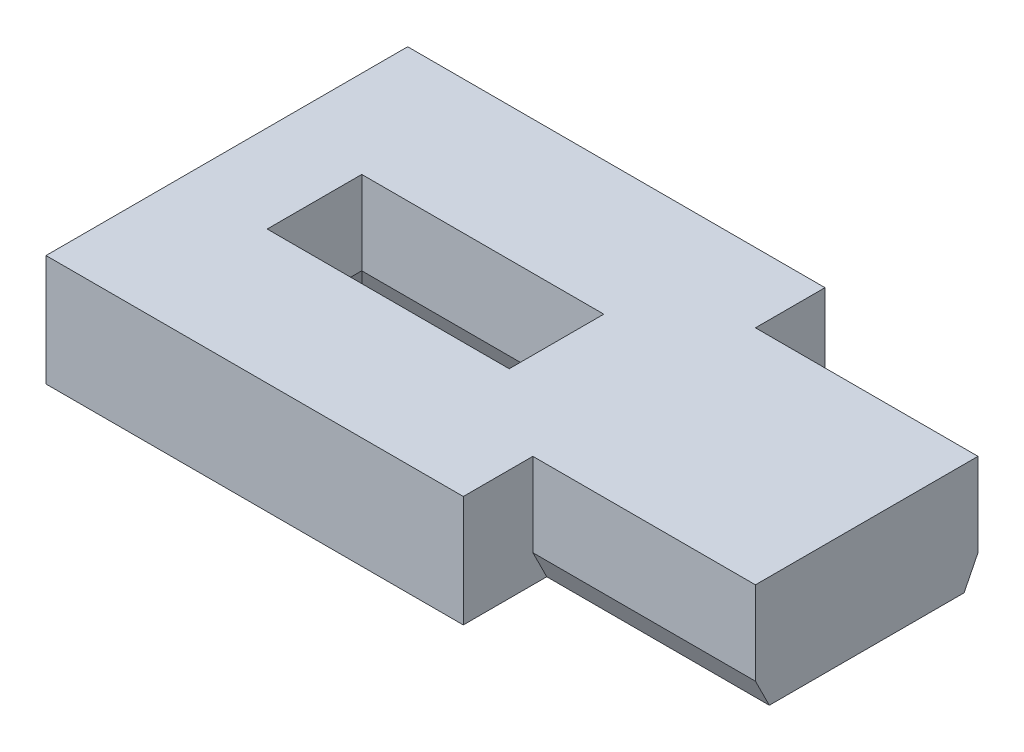
ISO-10303-21;
HEADER;
FILE_DESCRIPTION(('STEP AP214'),'2;1');
FILE_NAME('part.step','',(''),(''),'','','');
FILE_SCHEMA(('AUTOMOTIVE_DESIGN { 1 0 10303 214 1 1 1 1 }'));
ENDSEC;
DATA;
#1=APPLICATION_CONTEXT('core data for automotive mechanical design processes');
#2=APPLICATION_PROTOCOL_DEFINITION('international standard','automotive_design',2000,#1);
#3=PRODUCT_CONTEXT('',#1,'mechanical');
#4=PRODUCT('Part','Part','',(#3));
#5=PRODUCT_RELATED_PRODUCT_CATEGORY('part','',(#4));
#6=PRODUCT_DEFINITION_FORMATION('','',#4);
#7=PRODUCT_DEFINITION_CONTEXT('part definition',#1,'design');
#8=PRODUCT_DEFINITION('design','',#6,#7);
#9=PRODUCT_DEFINITION_SHAPE('','',#8);
#10=(LENGTH_UNIT() NAMED_UNIT(*) SI_UNIT(.MILLI.,.METRE.));
#11=(NAMED_UNIT(*) PLANE_ANGLE_UNIT() SI_UNIT($,.RADIAN.));
#12=(NAMED_UNIT(*) SI_UNIT($,.STERADIAN.) SOLID_ANGLE_UNIT());
#13=UNCERTAINTY_MEASURE_WITH_UNIT(LENGTH_MEASURE(1.E-05),#10,'distance_accuracy_value','');
#14=(GEOMETRIC_REPRESENTATION_CONTEXT(3) GLOBAL_UNCERTAINTY_ASSIGNED_CONTEXT((#13)) GLOBAL_UNIT_ASSIGNED_CONTEXT((#10,
#11,#12)) REPRESENTATION_CONTEXT('',''));
#15=CARTESIAN_POINT('',(0.,0.,0.));
#16=DIRECTION('',(0.,0.,1.));
#17=DIRECTION('',(1.,0.,0.));
#18=AXIS2_PLACEMENT_3D('',#15,#16,#17);
#19=CARTESIAN_POINT('',(7.5,4.,-6.5));
#20=DIRECTION('',(-1.,0.,0.));
#21=DIRECTION('',(0.,0.,1.));
#22=AXIS2_PLACEMENT_3D('',#19,#20,#21);
#23=PLANE('',#22);
#24=DIRECTION('',(0.,-1.,0.));
#25=VECTOR('',#24,1.);
#26=CARTESIAN_POINT('',(7.5,4.,4.));
#27=LINE('',#26,#25);
#28=CARTESIAN_POINT('',(7.5,4.,4.));
#29=VERTEX_POINT('',#28);
#30=CARTESIAN_POINT('',(7.5,1.00000000000001,4.));
#31=VERTEX_POINT('',#30);
#32=EDGE_CURVE('E153',#29,#31,#27,.T.);
#33=ORIENTED_EDGE('',*,*,#32,.F.);
#34=DIRECTION('',(0.,0.,-1.));
#35=VECTOR('',#34,1.);
#36=CARTESIAN_POINT('',(7.5,4.,-6.5));
#37=LINE('',#36,#35);
#38=CARTESIAN_POINT('',(7.5,4.,6.5));
#39=VERTEX_POINT('',#38);
#40=EDGE_CURVE('E164',#39,#29,#37,.T.);
#41=ORIENTED_EDGE('',*,*,#40,.F.);
#42=DIRECTION('',(0.,-1.,0.));
#43=VECTOR('',#42,1.);
#44=CARTESIAN_POINT('',(7.5,4.,6.5));
#45=LINE('',#44,#43);
#46=CARTESIAN_POINT('',(7.5,0.,6.5));
#47=VERTEX_POINT('',#46);
#48=EDGE_CURVE('E197',#39,#47,#45,.T.);
#49=ORIENTED_EDGE('',*,*,#48,.T.);
#50=DIRECTION('',(0.,0.,-1.));
#51=VECTOR('',#50,1.);
#52=CARTESIAN_POINT('',(7.5,0.,-6.5));
#53=LINE('',#52,#51);
#54=CARTESIAN_POINT('',(7.5,0.,3.49999999999999));
#55=VERTEX_POINT('',#54);
#56=EDGE_CURVE('E56',#47,#55,#53,.T.);
#57=ORIENTED_EDGE('',*,*,#56,.T.);
#58=DIRECTION('',(0.,-0.894427190999917,-0.447213595499957));
#59=VECTOR('',#58,1.);
#60=CARTESIAN_POINT('',(7.5,-0.799999999999986,3.10000000000001));
#61=LINE('',#60,#59);
#62=EDGE_CURVE('E43',#55,#31,#61,.F.);
#63=ORIENTED_EDGE('',*,*,#62,.T.);
#64=EDGE_LOOP('',(#33,#41,#49,#57,#63));
#65=FACE_BOUND('',#64,.T.);
#66=ADVANCED_FACE('F34',(#65),#23,.F.);
#67=CARTESIAN_POINT('',(0.,4.,0.));
#68=DIRECTION('',(0.,1.,0.));
#69=DIRECTION('',(0.,0.,1.));
#70=AXIS2_PLACEMENT_3D('',#67,#68,#69);
#71=PLANE('',#70);
#72=DIRECTION('',(0.,0.,1.));
#73=VECTOR('',#72,1.);
#74=CARTESIAN_POINT('',(-7.5,4.,-6.5));
#75=LINE('',#74,#73);
#76=CARTESIAN_POINT('',(-7.5,4.,-6.5));
#77=VERTEX_POINT('',#76);
#78=CARTESIAN_POINT('',(-7.5,4.,6.5));
#79=VERTEX_POINT('',#78);
#80=EDGE_CURVE('E191',#77,#79,#75,.T.);
#81=ORIENTED_EDGE('',*,*,#80,.T.);
#82=DIRECTION('',(1.,0.,0.));
#83=VECTOR('',#82,1.);
#84=CARTESIAN_POINT('',(-7.5,4.,6.5));
#85=LINE('',#84,#83);
#86=EDGE_CURVE('E171',#79,#39,#85,.T.);
#87=ORIENTED_EDGE('',*,*,#86,.T.);
#88=ORIENTED_EDGE('',*,*,#40,.T.);
#89=DIRECTION('',(1.,0.,0.));
#90=VECTOR('',#89,1.);
#91=CARTESIAN_POINT('',(15.5,4.,4.));
#92=LINE('',#91,#90);
#93=CARTESIAN_POINT('',(15.5,4.,4.));
#94=VERTEX_POINT('',#93);
#95=EDGE_CURVE('E149',#29,#94,#92,.T.);
#96=ORIENTED_EDGE('',*,*,#95,.T.);
#97=DIRECTION('',(0.,0.,-1.));
#98=VECTOR('',#97,1.);
#99=CARTESIAN_POINT('',(15.5,4.,-4.));
#100=LINE('',#99,#98);
#101=CARTESIAN_POINT('',(15.5,4.,-4.));
#102=VERTEX_POINT('',#101);
#103=EDGE_CURVE('E160',#94,#102,#100,.T.);
#104=ORIENTED_EDGE('',*,*,#103,.T.);
#105=DIRECTION('',(-1.,0.,0.));
#106=VECTOR('',#105,1.);
#107=CARTESIAN_POINT('',(7.5,4.,-4.));
#108=LINE('',#107,#106);
#109=CARTESIAN_POINT('',(7.5,4.,-4.));
#110=VERTEX_POINT('',#109);
#111=EDGE_CURVE('E255',#102,#110,#108,.T.);
#112=ORIENTED_EDGE('',*,*,#111,.T.);
#113=CARTESIAN_POINT('',(7.5,4.,-6.5));
#114=VERTEX_POINT('',#113);
#115=EDGE_CURVE('E174',#110,#114,#37,.T.);
#116=ORIENTED_EDGE('',*,*,#115,.T.);
#117=DIRECTION('',(-1.,0.,0.));
#118=VECTOR('',#117,1.);
#119=CARTESIAN_POINT('',(-7.5,4.,-6.5));
#120=LINE('',#119,#118);
#121=EDGE_CURVE('E173',#114,#77,#120,.T.);
#122=ORIENTED_EDGE('',*,*,#121,.T.);
#123=EDGE_LOOP('',(#81,#87,#88,#96,#104,#112,#116,#122));
#124=FACE_BOUND('',#123,.T.);
#125=DIRECTION('',(-1.,0.,0.));
#126=VECTOR('',#125,1.);
#127=CARTESIAN_POINT('',(4.35,4.,-1.7));
#128=LINE('',#127,#126);
#129=CARTESIAN_POINT('',(4.35,4.,-1.7));
#130=VERTEX_POINT('',#129);
#131=CARTESIAN_POINT('',(-4.35,4.,-1.7));
#132=VERTEX_POINT('',#131);
#133=EDGE_CURVE('E263',#130,#132,#128,.T.);
#134=ORIENTED_EDGE('',*,*,#133,.F.);
#135=DIRECTION('',(0.,0.,-1.));
#136=VECTOR('',#135,1.);
#137=CARTESIAN_POINT('',(4.35,4.,1.7));
#138=LINE('',#137,#136);
#139=CARTESIAN_POINT('',(4.35,4.,1.7));
#140=VERTEX_POINT('',#139);
#141=EDGE_CURVE('E166',#140,#130,#138,.T.);
#142=ORIENTED_EDGE('',*,*,#141,.F.);
#143=DIRECTION('',(1.,0.,0.));
#144=VECTOR('',#143,1.);
#145=CARTESIAN_POINT('',(4.35,4.,1.7));
#146=LINE('',#145,#144);
#147=CARTESIAN_POINT('',(-4.35,4.,1.7));
#148=VERTEX_POINT('',#147);
#149=EDGE_CURVE('E268',#148,#140,#146,.T.);
#150=ORIENTED_EDGE('',*,*,#149,.F.);
#151=DIRECTION('',(0.,0.,1.));
#152=VECTOR('',#151,1.);
#153=CARTESIAN_POINT('',(-4.35,4.,1.7));
#154=LINE('',#153,#152);
#155=EDGE_CURVE('E265',#132,#148,#154,.T.);
#156=ORIENTED_EDGE('',*,*,#155,.F.);
#157=EDGE_LOOP('',(#134,#142,#150,#156));
#158=FACE_BOUND('',#157,.T.);
#159=ADVANCED_FACE('F169',(#124,#158),#71,.T.);
#160=CARTESIAN_POINT('',(0.,0.,0.));
#161=DIRECTION('',(0.,1.,0.));
#162=DIRECTION('',(0.,0.,1.));
#163=AXIS2_PLACEMENT_3D('',#160,#161,#162);
#164=PLANE('',#163);
#165=DIRECTION('',(-1.,0.,0.));
#166=VECTOR('',#165,1.);
#167=CARTESIAN_POINT('',(-4.35,0.,-2.2));
#168=LINE('',#167,#166);
#169=CARTESIAN_POINT('',(4.85,0.,-2.2));
#170=VERTEX_POINT('',#169);
#171=CARTESIAN_POINT('',(-4.85,0.,-2.2));
#172=VERTEX_POINT('',#171);
#173=EDGE_CURVE('E206',#170,#172,#168,.T.);
#174=ORIENTED_EDGE('',*,*,#173,.T.);
#175=DIRECTION('',(0.,0.,1.));
#176=VECTOR('',#175,1.);
#177=CARTESIAN_POINT('',(-4.85,0.,1.7));
#178=LINE('',#177,#176);
#179=CARTESIAN_POINT('',(-4.85,0.,2.2));
#180=VERTEX_POINT('',#179);
#181=EDGE_CURVE('E208',#172,#180,#178,.T.);
#182=ORIENTED_EDGE('',*,*,#181,.T.);
#183=DIRECTION('',(1.,0.,0.));
#184=VECTOR('',#183,1.);
#185=CARTESIAN_POINT('',(4.35,0.,2.2));
#186=LINE('',#185,#184);
#187=CARTESIAN_POINT('',(4.85,0.,2.2));
#188=VERTEX_POINT('',#187);
#189=EDGE_CURVE('E202',#180,#188,#186,.T.);
#190=ORIENTED_EDGE('',*,*,#189,.T.);
#191=DIRECTION('',(0.,0.,-1.));
#192=VECTOR('',#191,1.);
#193=CARTESIAN_POINT('',(4.85,0.,-1.7));
#194=LINE('',#193,#192);
#195=EDGE_CURVE('E204',#188,#170,#194,.T.);
#196=ORIENTED_EDGE('',*,*,#195,.T.);
#197=EDGE_LOOP('',(#174,#182,#190,#196));
#198=FACE_BOUND('',#197,.T.);
#199=DIRECTION('',(0.,0.,-1.));
#200=VECTOR('',#199,1.);
#201=CARTESIAN_POINT('',(15.5,0.,-4.));
#202=LINE('',#201,#200);
#203=CARTESIAN_POINT('',(15.5,0.,3.5));
#204=VERTEX_POINT('',#203);
#205=CARTESIAN_POINT('',(15.5,0.,-3.5));
#206=VERTEX_POINT('',#205);
#207=EDGE_CURVE('E161',#204,#206,#202,.T.);
#208=ORIENTED_EDGE('',*,*,#207,.F.);
#209=DIRECTION('',(-1.,0.,0.));
#210=VECTOR('',#209,1.);
#211=CARTESIAN_POINT('',(0.,0.,3.5));
#212=LINE('',#211,#210);
#213=EDGE_CURVE('E238',#204,#55,#212,.T.);
#214=ORIENTED_EDGE('',*,*,#213,.T.);
#215=ORIENTED_EDGE('',*,*,#56,.F.);
#216=DIRECTION('',(1.,0.,0.));
#217=VECTOR('',#216,1.);
#218=CARTESIAN_POINT('',(-7.5,0.,6.5));
#219=LINE('',#218,#217);
#220=CARTESIAN_POINT('',(-7.5,0.,6.5));
#221=VERTEX_POINT('',#220);
#222=EDGE_CURVE('E184',#221,#47,#219,.T.);
#223=ORIENTED_EDGE('',*,*,#222,.F.);
#224=DIRECTION('',(0.,0.,1.));
#225=VECTOR('',#224,1.);
#226=CARTESIAN_POINT('',(-7.5,0.,-6.5));
#227=LINE('',#226,#225);
#228=CARTESIAN_POINT('',(-7.5,0.,-6.5));
#229=VERTEX_POINT('',#228);
#230=EDGE_CURVE('E181',#229,#221,#227,.T.);
#231=ORIENTED_EDGE('',*,*,#230,.F.);
#232=DIRECTION('',(-1.,0.,0.));
#233=VECTOR('',#232,1.);
#234=CARTESIAN_POINT('',(-7.5,0.,-6.5));
#235=LINE('',#234,#233);
#236=CARTESIAN_POINT('',(7.5,0.,-6.5));
#237=VERTEX_POINT('',#236);
#238=EDGE_CURVE('E189',#237,#229,#235,.T.);
#239=ORIENTED_EDGE('',*,*,#238,.F.);
#240=CARTESIAN_POINT('',(7.5,0.,-3.5));
#241=VERTEX_POINT('',#240);
#242=EDGE_CURVE('E187',#241,#237,#53,.T.);
#243=ORIENTED_EDGE('',*,*,#242,.F.);
#244=DIRECTION('',(1.,0.,0.));
#245=VECTOR('',#244,1.);
#246=CARTESIAN_POINT('',(0.,0.,-3.5));
#247=LINE('',#246,#245);
#248=EDGE_CURVE('E236',#241,#206,#247,.T.);
#249=ORIENTED_EDGE('',*,*,#248,.T.);
#250=EDGE_LOOP('',(#208,#214,#215,#223,#231,#239,#243,#249));
#251=FACE_BOUND('',#250,.T.);
#252=ADVANCED_FACE('F291',(#198,#251),#164,.F.);
#253=CARTESIAN_POINT('',(-7.5,4.,-6.5));
#254=DIRECTION('',(1.,0.,0.));
#255=DIRECTION('',(0.,0.,-1.));
#256=AXIS2_PLACEMENT_3D('',#253,#254,#255);
#257=PLANE('',#256);
#258=ORIENTED_EDGE('',*,*,#230,.T.);
#259=DIRECTION('',(0.,-1.,0.));
#260=VECTOR('',#259,1.);
#261=CARTESIAN_POINT('',(-7.5,4.,6.5));
#262=LINE('',#261,#260);
#263=EDGE_CURVE('E199',#79,#221,#262,.T.);
#264=ORIENTED_EDGE('',*,*,#263,.F.);
#265=ORIENTED_EDGE('',*,*,#80,.F.);
#266=DIRECTION('',(0.,-1.,0.));
#267=VECTOR('',#266,1.);
#268=CARTESIAN_POINT('',(-7.5,4.,-6.5));
#269=LINE('',#268,#267);
#270=EDGE_CURVE('E176',#77,#229,#269,.T.);
#271=ORIENTED_EDGE('',*,*,#270,.T.);
#272=EDGE_LOOP('',(#258,#264,#265,#271));
#273=FACE_BOUND('',#272,.T.);
#274=ADVANCED_FACE('F285',(#273),#257,.F.);
#275=CARTESIAN_POINT('',(-7.5,4.,6.5));
#276=DIRECTION('',(0.,0.,-1.));
#277=DIRECTION('',(-1.,0.,0.));
#278=AXIS2_PLACEMENT_3D('',#275,#276,#277);
#279=PLANE('',#278);
#280=ORIENTED_EDGE('',*,*,#222,.T.);
#281=ORIENTED_EDGE('',*,*,#48,.F.);
#282=ORIENTED_EDGE('',*,*,#86,.F.);
#283=ORIENTED_EDGE('',*,*,#263,.T.);
#284=EDGE_LOOP('',(#280,#281,#282,#283));
#285=FACE_BOUND('',#284,.T.);
#286=ADVANCED_FACE('F288',(#285),#279,.F.);
#287=ORIENTED_EDGE('',*,*,#115,.F.);
#288=DIRECTION('',(0.,-1.,0.));
#289=VECTOR('',#288,1.);
#290=CARTESIAN_POINT('',(7.5,4.,-4.));
#291=LINE('',#290,#289);
#292=CARTESIAN_POINT('',(7.5,1.00000000000001,-4.));
#293=VERTEX_POINT('',#292);
#294=EDGE_CURVE('E247',#110,#293,#291,.T.);
#295=ORIENTED_EDGE('',*,*,#294,.T.);
#296=DIRECTION('',(0.,0.894427190999917,-0.447213595499956));
#297=VECTOR('',#296,1.);
#298=CARTESIAN_POINT('',(7.5,4.4,-5.69999999999999));
#299=LINE('',#298,#297);
#300=EDGE_CURVE('E11',#293,#241,#299,.F.);
#301=ORIENTED_EDGE('',*,*,#300,.T.);
#302=ORIENTED_EDGE('',*,*,#242,.T.);
#303=DIRECTION('',(0.,-1.,0.));
#304=VECTOR('',#303,1.);
#305=CARTESIAN_POINT('',(7.5,4.,-6.5));
#306=LINE('',#305,#304);
#307=EDGE_CURVE('E194',#114,#237,#306,.T.);
#308=ORIENTED_EDGE('',*,*,#307,.F.);
#309=EDGE_LOOP('',(#287,#295,#301,#302,#308));
#310=FACE_BOUND('',#309,.T.);
#311=ADVANCED_FACE('F253',(#310),#23,.F.);
#312=CARTESIAN_POINT('',(-7.5,4.,-6.5));
#313=DIRECTION('',(0.,0.,1.));
#314=DIRECTION('',(1.,0.,0.));
#315=AXIS2_PLACEMENT_3D('',#312,#313,#314);
#316=PLANE('',#315);
#317=ORIENTED_EDGE('',*,*,#238,.T.);
#318=ORIENTED_EDGE('',*,*,#270,.F.);
#319=ORIENTED_EDGE('',*,*,#121,.F.);
#320=ORIENTED_EDGE('',*,*,#307,.T.);
#321=EDGE_LOOP('',(#317,#318,#319,#320));
#322=FACE_BOUND('',#321,.T.);
#323=ADVANCED_FACE('F301',(#322),#316,.F.);
#324=CARTESIAN_POINT('',(4.35,4.,1.7));
#325=DIRECTION('',(-1.,0.,0.));
#326=DIRECTION('',(0.,0.,1.));
#327=AXIS2_PLACEMENT_3D('',#324,#325,#326);
#328=PLANE('',#327);
#329=DIRECTION('',(0.,-1.,0.));
#330=VECTOR('',#329,1.);
#331=CARTESIAN_POINT('',(4.35,4.,-1.7));
#332=LINE('',#331,#330);
#333=CARTESIAN_POINT('',(4.35,1.,-1.7));
#334=VERTEX_POINT('',#333);
#335=EDGE_CURVE('E185',#130,#334,#332,.T.);
#336=ORIENTED_EDGE('',*,*,#335,.T.);
#337=DIRECTION('',(0.,0.,1.));
#338=VECTOR('',#337,1.);
#339=CARTESIAN_POINT('',(4.35,1.,1.7));
#340=LINE('',#339,#338);
#341=CARTESIAN_POINT('',(4.35,1.,1.7));
#342=VERTEX_POINT('',#341);
#343=EDGE_CURVE('E216',#334,#342,#340,.T.);
#344=ORIENTED_EDGE('',*,*,#343,.T.);
#345=DIRECTION('',(0.,-1.,0.));
#346=VECTOR('',#345,1.);
#347=CARTESIAN_POINT('',(4.35,4.,1.7));
#348=LINE('',#347,#346);
#349=EDGE_CURVE('E270',#140,#342,#348,.T.);
#350=ORIENTED_EDGE('',*,*,#349,.F.);
#351=ORIENTED_EDGE('',*,*,#141,.T.);
#352=EDGE_LOOP('',(#336,#344,#350,#351));
#353=FACE_BOUND('',#352,.T.);
#354=ADVANCED_FACE('F320',(#353),#328,.T.);
#355=CARTESIAN_POINT('',(4.35,4.,-1.7));
#356=DIRECTION('',(0.,0.,1.));
#357=DIRECTION('',(1.,0.,0.));
#358=AXIS2_PLACEMENT_3D('',#355,#356,#357);
#359=PLANE('',#358);
#360=DIRECTION('',(0.,-1.,0.));
#361=VECTOR('',#360,1.);
#362=CARTESIAN_POINT('',(-4.35,4.,-1.7));
#363=LINE('',#362,#361);
#364=CARTESIAN_POINT('',(-4.35,1.,-1.7));
#365=VERTEX_POINT('',#364);
#366=EDGE_CURVE('E276',#132,#365,#363,.T.);
#367=ORIENTED_EDGE('',*,*,#366,.T.);
#368=DIRECTION('',(1.,0.,0.));
#369=VECTOR('',#368,1.);
#370=CARTESIAN_POINT('',(4.35,1.,-1.7));
#371=LINE('',#370,#369);
#372=EDGE_CURVE('E214',#365,#334,#371,.T.);
#373=ORIENTED_EDGE('',*,*,#372,.T.);
#374=ORIENTED_EDGE('',*,*,#335,.F.);
#375=ORIENTED_EDGE('',*,*,#133,.T.);
#376=EDGE_LOOP('',(#367,#373,#374,#375));
#377=FACE_BOUND('',#376,.T.);
#378=ADVANCED_FACE('F383',(#377),#359,.T.);
#379=CARTESIAN_POINT('',(-4.35,4.,1.7));
#380=DIRECTION('',(1.,0.,0.));
#381=DIRECTION('',(0.,0.,-1.));
#382=AXIS2_PLACEMENT_3D('',#379,#380,#381);
#383=PLANE('',#382);
#384=DIRECTION('',(0.,-1.,0.));
#385=VECTOR('',#384,1.);
#386=CARTESIAN_POINT('',(-4.35,4.,1.7));
#387=LINE('',#386,#385);
#388=CARTESIAN_POINT('',(-4.35,1.,1.7));
#389=VERTEX_POINT('',#388);
#390=EDGE_CURVE('E273',#148,#389,#387,.T.);
#391=ORIENTED_EDGE('',*,*,#390,.T.);
#392=DIRECTION('',(0.,0.,-1.));
#393=VECTOR('',#392,1.);
#394=CARTESIAN_POINT('',(-4.35,1.,-1.7));
#395=LINE('',#394,#393);
#396=EDGE_CURVE('E211',#389,#365,#395,.T.);
#397=ORIENTED_EDGE('',*,*,#396,.T.);
#398=ORIENTED_EDGE('',*,*,#366,.F.);
#399=ORIENTED_EDGE('',*,*,#155,.T.);
#400=EDGE_LOOP('',(#391,#397,#398,#399));
#401=FACE_BOUND('',#400,.T.);
#402=ADVANCED_FACE('F373',(#401),#383,.T.);
#403=CARTESIAN_POINT('',(4.35,4.,1.7));
#404=DIRECTION('',(0.,0.,-1.));
#405=DIRECTION('',(-1.,0.,0.));
#406=AXIS2_PLACEMENT_3D('',#403,#404,#405);
#407=PLANE('',#406);
#408=ORIENTED_EDGE('',*,*,#349,.T.);
#409=DIRECTION('',(-1.,0.,0.));
#410=VECTOR('',#409,1.);
#411=CARTESIAN_POINT('',(-4.35,1.,1.7));
#412=LINE('',#411,#410);
#413=EDGE_CURVE('E218',#342,#389,#412,.T.);
#414=ORIENTED_EDGE('',*,*,#413,.T.);
#415=ORIENTED_EDGE('',*,*,#390,.F.);
#416=ORIENTED_EDGE('',*,*,#149,.T.);
#417=EDGE_LOOP('',(#408,#414,#415,#416));
#418=FACE_BOUND('',#417,.T.);
#419=ADVANCED_FACE('F369',(#418),#407,.T.);
#420=CARTESIAN_POINT('',(15.5,4.,4.));
#421=DIRECTION('',(0.,0.,-1.));
#422=DIRECTION('',(-1.,0.,0.));
#423=AXIS2_PLACEMENT_3D('',#420,#421,#422);
#424=PLANE('',#423);
#425=ORIENTED_EDGE('',*,*,#32,.T.);
#426=DIRECTION('',(1.,0.,0.));
#427=VECTOR('',#426,1.);
#428=CARTESIAN_POINT('',(15.5,1.00000000000001,4.));
#429=LINE('',#428,#427);
#430=CARTESIAN_POINT('',(15.5,1.00000000000001,4.));
#431=VERTEX_POINT('',#430);
#432=EDGE_CURVE('E220',#31,#431,#429,.T.);
#433=ORIENTED_EDGE('',*,*,#432,.T.);
#434=DIRECTION('',(0.,-1.,0.));
#435=VECTOR('',#434,1.);
#436=CARTESIAN_POINT('',(15.5,4.,4.));
#437=LINE('',#436,#435);
#438=EDGE_CURVE('E156',#94,#431,#437,.T.);
#439=ORIENTED_EDGE('',*,*,#438,.F.);
#440=ORIENTED_EDGE('',*,*,#95,.F.);
#441=EDGE_LOOP('',(#425,#433,#439,#440));
#442=FACE_BOUND('',#441,.T.);
#443=ADVANCED_FACE('F151',(#442),#424,.F.);
#444=CARTESIAN_POINT('',(15.5,4.,-4.));
#445=DIRECTION('',(-1.,0.,0.));
#446=DIRECTION('',(0.,0.,1.));
#447=AXIS2_PLACEMENT_3D('',#444,#445,#446);
#448=PLANE('',#447);
#449=ORIENTED_EDGE('',*,*,#438,.T.);
#450=DIRECTION('',(0.,0.894427190999917,0.447213595499957));
#451=VECTOR('',#450,1.);
#452=CARTESIAN_POINT('',(15.5,1.00000000000001,4.));
#453=LINE('',#452,#451);
#454=EDGE_CURVE('E234',#431,#204,#453,.F.);
#455=ORIENTED_EDGE('',*,*,#454,.T.);
#456=ORIENTED_EDGE('',*,*,#207,.T.);
#457=DIRECTION('',(0.,-0.894427190999917,0.447213595499956));
#458=VECTOR('',#457,1.);
#459=CARTESIAN_POINT('',(15.5,1.00000000000001,-4.));
#460=LINE('',#459,#458);
#461=CARTESIAN_POINT('',(15.5,1.00000000000001,-4.));
#462=VERTEX_POINT('',#461);
#463=EDGE_CURVE('E232',#206,#462,#460,.F.);
#464=ORIENTED_EDGE('',*,*,#463,.T.);
#465=DIRECTION('',(0.,-1.,0.));
#466=VECTOR('',#465,1.);
#467=CARTESIAN_POINT('',(15.5,4.,-4.));
#468=LINE('',#467,#466);
#469=EDGE_CURVE('E250',#102,#462,#468,.T.);
#470=ORIENTED_EDGE('',*,*,#469,.F.);
#471=ORIENTED_EDGE('',*,*,#103,.F.);
#472=EDGE_LOOP('',(#449,#455,#456,#464,#470,#471));
#473=FACE_BOUND('',#472,.T.);
#474=ADVANCED_FACE('F297',(#473),#448,.F.);
#475=CARTESIAN_POINT('',(7.5,4.,-4.));
#476=DIRECTION('',(0.,0.,1.));
#477=DIRECTION('',(1.,0.,0.));
#478=AXIS2_PLACEMENT_3D('',#475,#476,#477);
#479=PLANE('',#478);
#480=ORIENTED_EDGE('',*,*,#469,.T.);
#481=DIRECTION('',(-1.,0.,0.));
#482=VECTOR('',#481,1.);
#483=CARTESIAN_POINT('',(7.5,1.00000000000001,-4.));
#484=LINE('',#483,#482);
#485=EDGE_CURVE('E240',#462,#293,#484,.T.);
#486=ORIENTED_EDGE('',*,*,#485,.T.);
#487=ORIENTED_EDGE('',*,*,#294,.F.);
#488=ORIENTED_EDGE('',*,*,#111,.F.);
#489=EDGE_LOOP('',(#480,#486,#487,#488));
#490=FACE_BOUND('',#489,.T.);
#491=ADVANCED_FACE('F245',(#490),#479,.F.);
#492=CARTESIAN_POINT('',(4.85,0.,0.));
#493=DIRECTION('',(-0.894427190999916,-0.447213595499957,0.));
#494=DIRECTION('',(0.,0.,1.));
#495=AXIS2_PLACEMENT_3D('',#492,#493,#494);
#496=PLANE('',#495);
#497=DIRECTION('',(0.408248290463862,-0.816496580927727,0.408248290463862));
#498=VECTOR('',#497,1.);
#499=CARTESIAN_POINT('',(4.48333333333334,0.733333333333333,1.83333333333334));
#500=LINE('',#499,#498);
#501=EDGE_CURVE('E225',#342,#188,#500,.T.);
#502=ORIENTED_EDGE('',*,*,#501,.F.);
#503=ORIENTED_EDGE('',*,*,#343,.F.);
#504=DIRECTION('',(0.408248290463862,-0.816496580927727,-0.408248290463862));
#505=VECTOR('',#504,1.);
#506=CARTESIAN_POINT('',(4.04166666666667,1.61666666666666,-1.39166666666667));
#507=LINE('',#506,#505);
#508=EDGE_CURVE('E228',#170,#334,#507,.F.);
#509=ORIENTED_EDGE('',*,*,#508,.F.);
#510=ORIENTED_EDGE('',*,*,#195,.F.);
#511=EDGE_LOOP('',(#502,#503,#509,#510));
#512=FACE_BOUND('',#511,.T.);
#513=ADVANCED_FACE('F347',(#512),#496,.T.);
#514=CARTESIAN_POINT('',(0.,0.,-2.2));
#515=DIRECTION('',(0.,-0.447213595499957,0.894427190999916));
#516=DIRECTION('',(1.,0.,0.));
#517=AXIS2_PLACEMENT_3D('',#514,#515,#516);
#518=PLANE('',#517);
#519=ORIENTED_EDGE('',*,*,#508,.T.);
#520=ORIENTED_EDGE('',*,*,#372,.F.);
#521=DIRECTION('',(-0.408248290463862,-0.816496580927727,-0.408248290463862));
#522=VECTOR('',#521,1.);
#523=CARTESIAN_POINT('',(-4.48333333333334,0.733333333333333,-1.83333333333334));
#524=LINE('',#523,#522);
#525=EDGE_CURVE('E223',#172,#365,#524,.F.);
#526=ORIENTED_EDGE('',*,*,#525,.F.);
#527=ORIENTED_EDGE('',*,*,#173,.F.);
#528=EDGE_LOOP('',(#519,#520,#526,#527));
#529=FACE_BOUND('',#528,.T.);
#530=ADVANCED_FACE('F340',(#529),#518,.T.);
#531=CARTESIAN_POINT('',(0.,0.,2.2));
#532=DIRECTION('',(0.,-0.447213595499957,-0.894427190999916));
#533=DIRECTION('',(-1.,0.,0.));
#534=AXIS2_PLACEMENT_3D('',#531,#532,#533);
#535=PLANE('',#534);
#536=ORIENTED_EDGE('',*,*,#501,.T.);
#537=ORIENTED_EDGE('',*,*,#189,.F.);
#538=DIRECTION('',(0.408248290463862,0.816496580927727,-0.408248290463862));
#539=VECTOR('',#538,1.);
#540=CARTESIAN_POINT('',(-4.48333333333334,0.733333333333333,1.83333333333334));
#541=LINE('',#540,#539);
#542=EDGE_CURVE('E221',#389,#180,#541,.F.);
#543=ORIENTED_EDGE('',*,*,#542,.F.);
#544=ORIENTED_EDGE('',*,*,#413,.F.);
#545=EDGE_LOOP('',(#536,#537,#543,#544));
#546=FACE_BOUND('',#545,.T.);
#547=ADVANCED_FACE('F333',(#546),#535,.T.);
#548=CARTESIAN_POINT('',(-4.85,0.,0.));
#549=DIRECTION('',(0.894427190999916,-0.447213595499957,0.));
#550=DIRECTION('',(0.,0.,-1.));
#551=AXIS2_PLACEMENT_3D('',#548,#549,#550);
#552=PLANE('',#551);
#553=ORIENTED_EDGE('',*,*,#525,.T.);
#554=ORIENTED_EDGE('',*,*,#396,.F.);
#555=ORIENTED_EDGE('',*,*,#542,.T.);
#556=ORIENTED_EDGE('',*,*,#181,.F.);
#557=EDGE_LOOP('',(#553,#554,#555,#556));
#558=FACE_BOUND('',#557,.T.);
#559=ADVANCED_FACE('F306',(#558),#552,.T.);
#560=CARTESIAN_POINT('',(15.5,1.00000000000001,4.));
#561=DIRECTION('',(0.,0.447213595499957,-0.894427190999917));
#562=DIRECTION('',(1.,0.,0.));
#563=AXIS2_PLACEMENT_3D('',#560,#561,#562);
#564=PLANE('',#563);
#565=ORIENTED_EDGE('',*,*,#62,.F.);
#566=ORIENTED_EDGE('',*,*,#213,.F.);
#567=ORIENTED_EDGE('',*,*,#454,.F.);
#568=ORIENTED_EDGE('',*,*,#432,.F.);
#569=EDGE_LOOP('',(#565,#566,#567,#568));
#570=FACE_BOUND('',#569,.T.);
#571=ADVANCED_FACE('F295',(#570),#564,.F.);
#572=CARTESIAN_POINT('',(7.5,1.00000000000001,-4.));
#573=DIRECTION('',(0.,0.447213595499955,0.894427190999917));
#574=DIRECTION('',(-1.,0.,0.));
#575=AXIS2_PLACEMENT_3D('',#572,#573,#574);
#576=PLANE('',#575);
#577=ORIENTED_EDGE('',*,*,#463,.F.);
#578=ORIENTED_EDGE('',*,*,#248,.F.);
#579=ORIENTED_EDGE('',*,*,#300,.F.);
#580=ORIENTED_EDGE('',*,*,#485,.F.);
#581=EDGE_LOOP('',(#577,#578,#579,#580));
#582=FACE_BOUND('',#581,.T.);
#583=ADVANCED_FACE('F37',(#582),#576,.F.);
#584=CLOSED_SHELL('',(#66,#159,#252,#274,#286,#311,#323,#354,#378,#402,#419,#443,#474,#491,#513,
#530,#547,#559,#571,#583));
#585=MANIFOLD_SOLID_BREP('B2',#584);
#586=ADVANCED_BREP_SHAPE_REPRESENTATION('',(#18,#585),#14);
#587=SHAPE_DEFINITION_REPRESENTATION(#9,#586);
ENDSEC;
END-ISO-10303-21;
